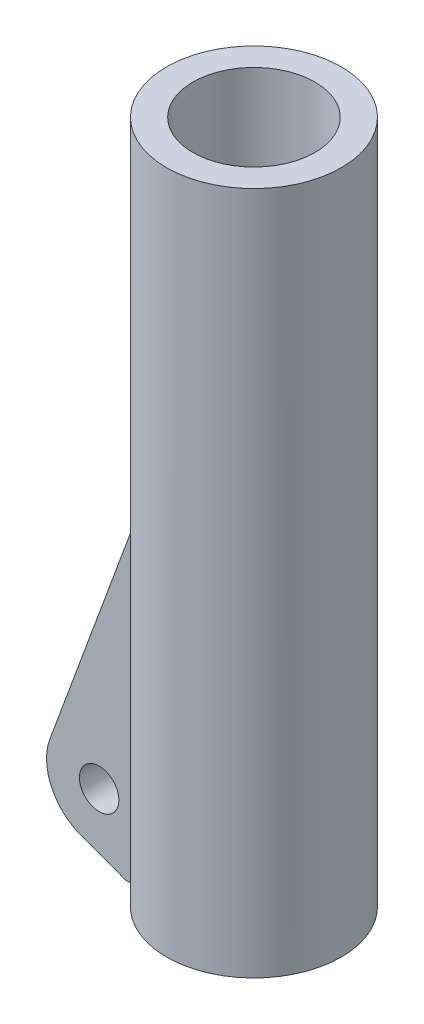
ISO-10303-21;
HEADER;
FILE_DESCRIPTION(('STEP AP214'),'2;1');
FILE_NAME('part.step','',(''),(''),'','','');
FILE_SCHEMA(('AUTOMOTIVE_DESIGN { 1 0 10303 214 1 1 1 1 }'));
ENDSEC;
DATA;
#1=APPLICATION_CONTEXT('core data for automotive mechanical design processes');
#2=APPLICATION_PROTOCOL_DEFINITION('international standard','automotive_design',2000,#1);
#3=PRODUCT_CONTEXT('',#1,'mechanical');
#4=PRODUCT('Part','Part','',(#3));
#5=PRODUCT_RELATED_PRODUCT_CATEGORY('part','',(#4));
#6=PRODUCT_DEFINITION_FORMATION('','',#4);
#7=PRODUCT_DEFINITION_CONTEXT('part definition',#1,'design');
#8=PRODUCT_DEFINITION('design','',#6,#7);
#9=PRODUCT_DEFINITION_SHAPE('','',#8);
#10=(LENGTH_UNIT() NAMED_UNIT(*) SI_UNIT(.MILLI.,.METRE.));
#11=(NAMED_UNIT(*) PLANE_ANGLE_UNIT() SI_UNIT($,.RADIAN.));
#12=(NAMED_UNIT(*) SI_UNIT($,.STERADIAN.) SOLID_ANGLE_UNIT());
#13=UNCERTAINTY_MEASURE_WITH_UNIT(LENGTH_MEASURE(1.E-05),#10,'distance_accuracy_value','');
#14=(GEOMETRIC_REPRESENTATION_CONTEXT(3) GLOBAL_UNCERTAINTY_ASSIGNED_CONTEXT((#13)) GLOBAL_UNIT_ASSIGNED_CONTEXT((#10,
#11,#12)) REPRESENTATION_CONTEXT('',''));
#15=CARTESIAN_POINT('',(0.,0.,0.));
#16=DIRECTION('',(0.,0.,1.));
#17=DIRECTION('',(1.,0.,0.));
#18=AXIS2_PLACEMENT_3D('',#15,#16,#17);
#19=CARTESIAN_POINT('',(0.,164.973,0.));
#20=DIRECTION('',(0.,1.,0.));
#21=DIRECTION('',(0.,0.,1.));
#22=AXIS2_PLACEMENT_3D('',#19,#20,#21);
#23=PLANE('',#22);
#24=CARTESIAN_POINT('',(0.,164.973,0.));
#25=DIRECTION('',(0.,1.,0.));
#26=DIRECTION('',(0.,0.,1.));
#27=AXIS2_PLACEMENT_3D('',#24,#25,#26);
#28=CIRCLE('',#27,42.164);
#29=CARTESIAN_POINT('',(0.,164.973,42.164));
#30=VERTEX_POINT('',#29);
#31=EDGE_CURVE('E125',#30,#30,#28,.T.);
#32=ORIENTED_EDGE('',*,*,#31,.T.);
#33=EDGE_LOOP('',(#32));
#34=FACE_BOUND('',#33,.T.);
#35=CARTESIAN_POINT('',(0.,164.973,0.));
#36=DIRECTION('',(0.,1.,0.));
#37=DIRECTION('',(0.,0.,1.));
#38=AXIS2_PLACEMENT_3D('',#35,#36,#37);
#39=CIRCLE('',#38,29.464);
#40=CARTESIAN_POINT('',(0.,164.973,-29.464));
#41=VERTEX_POINT('',#40);
#42=EDGE_CURVE('E119',#41,#41,#39,.T.);
#43=ORIENTED_EDGE('',*,*,#42,.F.);
#44=EDGE_LOOP('',(#43));
#45=FACE_BOUND('',#44,.T.);
#46=ADVANCED_FACE('F35',(#34,#45),#23,.T.);
#47=CARTESIAN_POINT('',(0.,-164.973,0.));
#48=DIRECTION('',(0.,1.,0.));
#49=DIRECTION('',(0.,0.,1.));
#50=AXIS2_PLACEMENT_3D('',#47,#48,#49);
#51=PLANE('',#50);
#52=CARTESIAN_POINT('',(0.,-164.973,0.));
#53=DIRECTION('',(0.,1.,0.));
#54=DIRECTION('',(0.,0.,1.));
#55=AXIS2_PLACEMENT_3D('',#52,#53,#54);
#56=CIRCLE('',#55,29.464);
#57=CARTESIAN_POINT('',(0.,-164.973,-29.464));
#58=VERTEX_POINT('',#57);
#59=EDGE_CURVE('E118',#58,#58,#56,.T.);
#60=ORIENTED_EDGE('',*,*,#59,.T.);
#61=EDGE_LOOP('',(#60));
#62=FACE_BOUND('',#61,.T.);
#63=CARTESIAN_POINT('',(0.,-164.973,0.));
#64=DIRECTION('',(0.,1.,0.));
#65=DIRECTION('',(0.,0.,1.));
#66=AXIS2_PLACEMENT_3D('',#63,#64,#65);
#67=CIRCLE('',#66,42.164);
#68=CARTESIAN_POINT('',(-37.2025332731186,-164.973,19.84375));
#69=VERTEX_POINT('',#68);
#70=CARTESIAN_POINT('',(-37.2025332731186,-164.973,-19.84375));
#71=VERTEX_POINT('',#70);
#72=EDGE_CURVE('E122',#69,#71,#67,.T.);
#73=ORIENTED_EDGE('',*,*,#72,.F.);
#74=DIRECTION('',(1.,0.,0.));
#75=VECTOR('',#74,1.);
#76=CARTESIAN_POINT('',(-42.164,-164.973,19.84375));
#77=LINE('',#76,#75);
#78=CARTESIAN_POINT('',(-42.164,-164.973,19.84375));
#79=VERTEX_POINT('',#78);
#80=EDGE_CURVE('E85',#79,#69,#77,.T.);
#81=ORIENTED_EDGE('',*,*,#80,.F.);
#82=DIRECTION('',(0.,0.,-1.));
#83=VECTOR('',#82,1.);
#84=CARTESIAN_POINT('',(-42.164,-164.973,19.84375));
#85=LINE('',#84,#83);
#86=CARTESIAN_POINT('',(-42.164,-164.973,-19.84375));
#87=VERTEX_POINT('',#86);
#88=EDGE_CURVE('E101',#79,#87,#85,.T.);
#89=ORIENTED_EDGE('',*,*,#88,.T.);
#90=DIRECTION('',(1.,0.,0.));
#91=VECTOR('',#90,1.);
#92=CARTESIAN_POINT('',(-42.164,-164.973,-19.84375));
#93=LINE('',#92,#91);
#94=EDGE_CURVE('E105',#87,#71,#93,.T.);
#95=ORIENTED_EDGE('',*,*,#94,.T.);
#96=EDGE_LOOP('',(#73,#81,#89,#95));
#97=FACE_BOUND('',#96,.T.);
#98=ADVANCED_FACE('F134',(#62,#97),#51,.F.);
#99=CARTESIAN_POINT('',(0.,164.973,0.));
#100=DIRECTION('',(0.,-1.,0.));
#101=DIRECTION('',(0.,0.,-1.));
#102=AXIS2_PLACEMENT_3D('',#99,#100,#101);
#103=CYLINDRICAL_SURFACE('',#102,42.164);
#104=CARTESIAN_POINT('',(0.,89.1108747435783,0.));
#105=DIRECTION('',(0.938313881066485,-0.345784702666196,0.));
#106=DIRECTION('',(-0.345784702666196,-0.938313881066485,0.));
#107=AXIS2_PLACEMENT_3D('',#104,#105,#106);
#108=ELLIPSE('',#107,121.937146654816,42.164);
#109=CARTESIAN_POINT('',(-37.2025332731186,-11.8411139125049,19.84375));
#110=VERTEX_POINT('',#109);
#111=CARTESIAN_POINT('',(-37.2025332731186,-11.8411139125049,-19.84375));
#112=VERTEX_POINT('',#111);
#113=EDGE_CURVE('E49',#110,#112,#108,.T.);
#114=ORIENTED_EDGE('',*,*,#113,.F.);
#115=DIRECTION('',(0.,-1.,0.));
#116=VECTOR('',#115,1.);
#117=CARTESIAN_POINT('',(-37.2025332731186,164.973,19.84375));
#118=LINE('',#117,#116);
#119=EDGE_CURVE('E11',#110,#69,#118,.T.);
#120=ORIENTED_EDGE('',*,*,#119,.T.);
#121=ORIENTED_EDGE('',*,*,#72,.T.);
#122=DIRECTION('',(0.,-1.,0.));
#123=VECTOR('',#122,1.);
#124=CARTESIAN_POINT('',(-37.2025332731186,164.973,-19.84375));
#125=LINE('',#124,#123);
#126=EDGE_CURVE('E43',#112,#71,#125,.T.);
#127=ORIENTED_EDGE('',*,*,#126,.F.);
#128=EDGE_LOOP('',(#114,#120,#121,#127));
#129=FACE_BOUND('',#128,.T.);
#130=ORIENTED_EDGE('',*,*,#31,.F.);
#131=EDGE_LOOP('',(#130));
#132=FACE_BOUND('',#131,.T.);
#133=ADVANCED_FACE('F37',(#129,#132),#103,.T.);
#134=CARTESIAN_POINT('',(0.,164.973,0.));
#135=DIRECTION('',(0.,-1.,0.));
#136=DIRECTION('',(0.,0.,-1.));
#137=AXIS2_PLACEMENT_3D('',#134,#135,#136);
#138=CYLINDRICAL_SURFACE('',#137,29.464);
#139=CARTESIAN_POINT('',(0.,-164.973,-29.464));
#140=CARTESIAN_POINT('',(0.,-161.5360625,-29.464));
#141=CARTESIAN_POINT('',(0.,-158.099125,-29.464));
#142=CARTESIAN_POINT('',(0.,-151.22525,-29.464));
#143=CARTESIAN_POINT('',(0.,-147.7883125,-29.464));
#144=CARTESIAN_POINT('',(0.,-140.9144375,-29.464));
#145=CARTESIAN_POINT('',(0.,-137.4775,-29.464));
#146=CARTESIAN_POINT('',(0.,-130.603625,-29.464));
#147=CARTESIAN_POINT('',(0.,-127.1666875,-29.464));
#148=CARTESIAN_POINT('',(0.,-120.2928125,-29.464));
#149=CARTESIAN_POINT('',(0.,-116.855875,-29.464));
#150=CARTESIAN_POINT('',(0.,-109.982,-29.464));
#151=CARTESIAN_POINT('',(0.,-106.5450625,-29.464));
#152=CARTESIAN_POINT('',(0.,-99.6711875,-29.464));
#153=CARTESIAN_POINT('',(0.,-96.23425,-29.464));
#154=CARTESIAN_POINT('',(0.,-89.360375,-29.464));
#155=CARTESIAN_POINT('',(0.,-85.9234375,-29.464));
#156=CARTESIAN_POINT('',(0.,-79.0495625,-29.464));
#157=CARTESIAN_POINT('',(0.,-75.612625,-29.464));
#158=CARTESIAN_POINT('',(0.,-68.73875,-29.464));
#159=CARTESIAN_POINT('',(0.,-65.3018125,-29.464));
#160=CARTESIAN_POINT('',(0.,-58.4279375,-29.464));
#161=CARTESIAN_POINT('',(0.,-54.991,-29.464));
#162=CARTESIAN_POINT('',(0.,-48.117125,-29.464));
#163=CARTESIAN_POINT('',(0.,-44.6801875,-29.464));
#164=CARTESIAN_POINT('',(0.,-37.8063125,-29.464));
#165=CARTESIAN_POINT('',(0.,-34.369375,-29.464));
#166=CARTESIAN_POINT('',(0.,-27.4955,-29.464));
#167=CARTESIAN_POINT('',(0.,-24.0585625,-29.464));
#168=CARTESIAN_POINT('',(0.,-17.1846875,-29.464));
#169=CARTESIAN_POINT('',(0.,-13.74775,-29.464));
#170=CARTESIAN_POINT('',(0.,-6.87387499999999,-29.464));
#171=CARTESIAN_POINT('',(0.,-3.43693749999999,-29.464));
#172=CARTESIAN_POINT('',(0.,3.43693749999999,-29.464));
#173=CARTESIAN_POINT('',(0.,6.87387499999999,-29.464));
#174=CARTESIAN_POINT('',(0.,13.74775,-29.464));
#175=CARTESIAN_POINT('',(0.,17.1846875,-29.464));
#176=CARTESIAN_POINT('',(0.,24.0585625,-29.464));
#177=CARTESIAN_POINT('',(0.,27.4955,-29.464));
#178=CARTESIAN_POINT('',(0.,34.369375,-29.464));
#179=CARTESIAN_POINT('',(0.,37.8063125,-29.464));
#180=CARTESIAN_POINT('',(0.,44.6801875,-29.464));
#181=CARTESIAN_POINT('',(0.,48.117125,-29.464));
#182=CARTESIAN_POINT('',(0.,54.991,-29.464));
#183=CARTESIAN_POINT('',(0.,58.4279375,-29.464));
#184=CARTESIAN_POINT('',(0.,65.3018125,-29.464));
#185=CARTESIAN_POINT('',(0.,68.73875,-29.464));
#186=CARTESIAN_POINT('',(0.,75.612625,-29.464));
#187=CARTESIAN_POINT('',(0.,79.0495625,-29.464));
#188=CARTESIAN_POINT('',(0.,85.9234375,-29.464));
#189=CARTESIAN_POINT('',(0.,89.360375,-29.464));
#190=CARTESIAN_POINT('',(0.,96.23425,-29.464));
#191=CARTESIAN_POINT('',(0.,99.6711875,-29.464));
#192=CARTESIAN_POINT('',(0.,106.5450625,-29.464));
#193=CARTESIAN_POINT('',(0.,109.982,-29.464));
#194=CARTESIAN_POINT('',(0.,116.855875,-29.464));
#195=CARTESIAN_POINT('',(0.,120.2928125,-29.464));
#196=CARTESIAN_POINT('',(0.,127.1666875,-29.464));
#197=CARTESIAN_POINT('',(0.,130.603625,-29.464));
#198=CARTESIAN_POINT('',(0.,137.4775,-29.464));
#199=CARTESIAN_POINT('',(0.,140.9144375,-29.464));
#200=CARTESIAN_POINT('',(0.,147.7883125,-29.464));
#201=CARTESIAN_POINT('',(0.,151.22525,-29.464));
#202=CARTESIAN_POINT('',(0.,158.099125,-29.464));
#203=CARTESIAN_POINT('',(0.,161.5360625,-29.464));
#204=CARTESIAN_POINT('',(0.,164.973,-29.464));
#205=B_SPLINE_CURVE_WITH_KNOTS('',3,(#139,#140,#141,#142,#143,#144,#145,#146,#147,#148,#149,
#150,#151,#152,#153,#154,#155,#156,#157,#158,#159,#160,#161,#162,#163,#164,#165,#166,#167,#168,
#169,#170,#171,#172,#173,#174,#175,#176,#177,#178,#179,#180,#181,#182,#183,#184,#185,#186,#187,
#188,#189,#190,#191,#192,#193,#194,#195,#196,#197,#198,#199,#200,#201,#202,#203,#204),
.UNSPECIFIED.,.F.,.F.,(4,2,2,2,2,2,2,2,2,2,2,2,2,2,2,2,2,2,2,2,2,2,2,2,2,2,2,2,2,2,2,2,4),(0.,
10.3108125,20.621625,30.9324375,41.24325,51.5540625,61.864875,72.1756875,82.4865,92.7973125,
103.108125,113.4189375,123.72975,134.0405625,144.351375,154.6621875,164.973,175.2838125,
185.594625,195.9054375,206.21625,216.5270625,226.837875,237.1486875,247.4595,257.7703125,
268.081125,278.3919375,288.70275,299.0135625,309.324375,319.6351875,329.946),.UNSPECIFIED.);
#206=EDGE_CURVE('BSEAM150',#58,#41,#205,.T.);
#207=ORIENTED_EDGE('',*,*,#59,.F.);
#208=ORIENTED_EDGE('',*,*,#42,.T.);
#209=ORIENTED_EDGE('',*,*,#206,.T.);
#210=ORIENTED_EDGE('',*,*,#206,.F.);
#211=EDGE_LOOP('',(#207,#209,#208,#210));
#212=FACE_BOUND('',#211,.T.);
#213=ADVANCED_FACE('F150',(#212),#138,.F.);
#214=CARTESIAN_POINT('',(-54.864,-133.223,19.84375));
#215=DIRECTION('',(0.,0.,1.));
#216=DIRECTION('',(1.,0.,0.));
#217=AXIS2_PLACEMENT_3D('',#214,#215,#216);
#218=PLANE('',#217);
#219=CARTESIAN_POINT('',(-54.864,-133.223,19.84375));
#220=DIRECTION('',(0.,0.,1.));
#221=DIRECTION('',(1.,0.,0.));
#222=AXIS2_PLACEMENT_3D('',#219,#220,#221);
#223=CIRCLE('',#222,9.525);
#224=CARTESIAN_POINT('',(-64.389,-133.223,19.84375));
#225=VERTEX_POINT('',#224);
#226=EDGE_CURVE('E108',#225,#225,#223,.T.);
#227=ORIENTED_EDGE('',*,*,#226,.F.);
#228=EDGE_LOOP('',(#227));
#229=FACE_BOUND('',#228,.T.);
#230=ORIENTED_EDGE('',*,*,#119,.F.);
#231=DIRECTION('',(-0.345784702666197,-0.938313881066485,0.));
#232=VECTOR('',#231,1.);
#233=CARTESIAN_POINT('',(-78.6971725790887,-124.440068552279,19.84375));
#234=LINE('',#233,#232);
#235=CARTESIAN_POINT('',(-78.6971725790887,-124.440068552279,19.84375));
#236=VERTEX_POINT('',#235);
#237=EDGE_CURVE('E77',#110,#236,#234,.T.);
#238=ORIENTED_EDGE('',*,*,#237,.T.);
#239=CARTESIAN_POINT('',(-54.864,-133.223,19.84375));
#240=DIRECTION('',(0.,0.,1.));
#241=DIRECTION('',(1.,0.,0.));
#242=AXIS2_PLACEMENT_3D('',#239,#240,#241);
#243=CIRCLE('',#242,25.4);
#244=CARTESIAN_POINT('',(-63.6469314477214,-157.056172579089,19.84375));
#245=VERTEX_POINT('',#244);
#246=EDGE_CURVE('E81',#236,#245,#243,.T.);
#247=ORIENTED_EDGE('',*,*,#246,.T.);
#248=DIRECTION('',(0.938313881066485,-0.345784702666196,0.));
#249=VECTOR('',#248,1.);
#250=CARTESIAN_POINT('',(-63.6469314477214,-157.056172579089,19.84375));
#251=LINE('',#250,#249);
#252=EDGE_CURVE('E99',#245,#79,#251,.T.);
#253=ORIENTED_EDGE('',*,*,#252,.T.);
#254=ORIENTED_EDGE('',*,*,#80,.T.);
#255=EDGE_LOOP('',(#230,#238,#247,#253,#254));
#256=FACE_BOUND('',#255,.T.);
#257=ADVANCED_FACE('F79',(#229,#256),#218,.T.);
#258=CARTESIAN_POINT('',(-54.864,-133.223,-19.84375));
#259=DIRECTION('',(0.,0.,1.));
#260=DIRECTION('',(1.,0.,0.));
#261=AXIS2_PLACEMENT_3D('',#258,#259,#260);
#262=PLANE('',#261);
#263=CARTESIAN_POINT('',(-54.864,-133.223,-19.84375));
#264=DIRECTION('',(0.,0.,1.));
#265=DIRECTION('',(1.,0.,0.));
#266=AXIS2_PLACEMENT_3D('',#263,#264,#265);
#267=CIRCLE('',#266,9.525);
#268=CARTESIAN_POINT('',(-64.389,-133.223,-19.84375));
#269=VERTEX_POINT('',#268);
#270=EDGE_CURVE('E140',#269,#269,#267,.T.);
#271=ORIENTED_EDGE('',*,*,#270,.T.);
#272=EDGE_LOOP('',(#271));
#273=FACE_BOUND('',#272,.T.);
#274=DIRECTION('',(-0.345784702666197,-0.938313881066485,0.));
#275=VECTOR('',#274,1.);
#276=CARTESIAN_POINT('',(-78.6971725790887,-124.440068552279,-19.84375));
#277=LINE('',#276,#275);
#278=CARTESIAN_POINT('',(-78.6971725790887,-124.440068552279,-19.84375));
#279=VERTEX_POINT('',#278);
#280=EDGE_CURVE('E91',#112,#279,#277,.T.);
#281=ORIENTED_EDGE('',*,*,#280,.F.);
#282=ORIENTED_EDGE('',*,*,#126,.T.);
#283=ORIENTED_EDGE('',*,*,#94,.F.);
#284=DIRECTION('',(0.938313881066485,-0.345784702666196,0.));
#285=VECTOR('',#284,1.);
#286=CARTESIAN_POINT('',(-63.6469314477214,-157.056172579089,-19.84375));
#287=LINE('',#286,#285);
#288=CARTESIAN_POINT('',(-63.6469314477214,-157.056172579089,-19.84375));
#289=VERTEX_POINT('',#288);
#290=EDGE_CURVE('E112',#289,#87,#287,.T.);
#291=ORIENTED_EDGE('',*,*,#290,.F.);
#292=CARTESIAN_POINT('',(-54.864,-133.223,-19.84375));
#293=DIRECTION('',(0.,0.,1.));
#294=DIRECTION('',(1.,0.,0.));
#295=AXIS2_PLACEMENT_3D('',#292,#293,#294);
#296=CIRCLE('',#295,25.4);
#297=EDGE_CURVE('E110',#279,#289,#296,.T.);
#298=ORIENTED_EDGE('',*,*,#297,.F.);
#299=EDGE_LOOP('',(#281,#282,#283,#291,#298));
#300=FACE_BOUND('',#299,.T.);
#301=ADVANCED_FACE('F131',(#273,#300),#262,.F.);
#302=CARTESIAN_POINT('',(-78.6971725790887,-124.440068552279,19.84375));
#303=DIRECTION('',(0.938313881066485,-0.345784702666196,0.));
#304=DIRECTION('',(0.345784702666196,0.938313881066485,0.));
#305=AXIS2_PLACEMENT_3D('',#302,#303,#304);
#306=PLANE('',#305);
#307=ORIENTED_EDGE('',*,*,#237,.F.);
#308=ORIENTED_EDGE('',*,*,#113,.T.);
#309=ORIENTED_EDGE('',*,*,#280,.T.);
#310=DIRECTION('',(0.,0.,-1.));
#311=VECTOR('',#310,1.);
#312=CARTESIAN_POINT('',(-78.6971725790887,-124.440068552279,19.84375));
#313=LINE('',#312,#311);
#314=EDGE_CURVE('E88',#236,#279,#313,.T.);
#315=ORIENTED_EDGE('',*,*,#314,.F.);
#316=EDGE_LOOP('',(#307,#308,#309,#315));
#317=FACE_BOUND('',#316,.T.);
#318=ADVANCED_FACE('F89',(#317),#306,.F.);
#319=CARTESIAN_POINT('',(-54.864,-133.223,19.84375));
#320=DIRECTION('',(0.,0.,-1.));
#321=DIRECTION('',(-1.,0.,0.));
#322=AXIS2_PLACEMENT_3D('',#319,#320,#321);
#323=CYLINDRICAL_SURFACE('',#322,25.4);
#324=ORIENTED_EDGE('',*,*,#297,.T.);
#325=DIRECTION('',(0.,0.,-1.));
#326=VECTOR('',#325,1.);
#327=CARTESIAN_POINT('',(-63.6469314477214,-157.056172579089,19.84375));
#328=LINE('',#327,#326);
#329=EDGE_CURVE('E94',#245,#289,#328,.T.);
#330=ORIENTED_EDGE('',*,*,#329,.F.);
#331=ORIENTED_EDGE('',*,*,#246,.F.);
#332=ORIENTED_EDGE('',*,*,#314,.T.);
#333=EDGE_LOOP('',(#324,#330,#331,#332));
#334=FACE_BOUND('',#333,.T.);
#335=ADVANCED_FACE('F96',(#334),#323,.T.);
#336=CARTESIAN_POINT('',(-63.6469314477214,-157.056172579089,19.84375));
#337=DIRECTION('',(0.345784702666196,0.938313881066485,0.));
#338=DIRECTION('',(-0.938313881066486,0.345784702666196,0.));
#339=AXIS2_PLACEMENT_3D('',#336,#337,#338);
#340=PLANE('',#339);
#341=ORIENTED_EDGE('',*,*,#290,.T.);
#342=ORIENTED_EDGE('',*,*,#88,.F.);
#343=ORIENTED_EDGE('',*,*,#252,.F.);
#344=ORIENTED_EDGE('',*,*,#329,.T.);
#345=EDGE_LOOP('',(#341,#342,#343,#344));
#346=FACE_BOUND('',#345,.T.);
#347=ADVANCED_FACE('F138',(#346),#340,.F.);
#348=CARTESIAN_POINT('',(-54.864,-133.223,19.84375));
#349=DIRECTION('',(0.,0.,-1.));
#350=DIRECTION('',(-1.,0.,0.));
#351=AXIS2_PLACEMENT_3D('',#348,#349,#350);
#352=CYLINDRICAL_SURFACE('',#351,9.525);
#353=CARTESIAN_POINT('',(-64.389,-133.223,19.84375));
#354=CARTESIAN_POINT('',(-64.389,-133.223,19.4303385416667));
#355=CARTESIAN_POINT('',(-64.389,-133.223,19.0169270833333));
#356=CARTESIAN_POINT('',(-64.389,-133.223,18.1901041666667));
#357=CARTESIAN_POINT('',(-64.389,-133.223,17.7766927083333));
#358=CARTESIAN_POINT('',(-64.389,-133.223,16.9498697916667));
#359=CARTESIAN_POINT('',(-64.389,-133.223,16.5364583333333));
#360=CARTESIAN_POINT('',(-64.389,-133.223,15.7096354166667));
#361=CARTESIAN_POINT('',(-64.389,-133.223,15.2962239583333));
#362=CARTESIAN_POINT('',(-64.389,-133.223,14.4694010416667));
#363=CARTESIAN_POINT('',(-64.389,-133.223,14.0559895833333));
#364=CARTESIAN_POINT('',(-64.389,-133.223,13.2291666666667));
#365=CARTESIAN_POINT('',(-64.389,-133.223,12.8157552083333));
#366=CARTESIAN_POINT('',(-64.389,-133.223,11.9889322916667));
#367=CARTESIAN_POINT('',(-64.389,-133.223,11.5755208333333));
#368=CARTESIAN_POINT('',(-64.389,-133.223,10.7486979166667));
#369=CARTESIAN_POINT('',(-64.389,-133.223,10.3352864583333));
#370=CARTESIAN_POINT('',(-64.389,-133.223,9.50846354166666));
#371=CARTESIAN_POINT('',(-64.389,-133.223,9.09505208333333));
#372=CARTESIAN_POINT('',(-64.389,-133.223,8.26822916666666));
#373=CARTESIAN_POINT('',(-64.389,-133.223,7.85481770833333));
#374=CARTESIAN_POINT('',(-64.389,-133.223,7.02799479166666));
#375=CARTESIAN_POINT('',(-64.389,-133.223,6.61458333333333));
#376=CARTESIAN_POINT('',(-64.389,-133.223,5.78776041666666));
#377=CARTESIAN_POINT('',(-64.389,-133.223,5.37434895833333));
#378=CARTESIAN_POINT('',(-64.389,-133.223,4.54752604166666));
#379=CARTESIAN_POINT('',(-64.389,-133.223,4.13411458333333));
#380=CARTESIAN_POINT('',(-64.389,-133.223,3.30729166666666));
#381=CARTESIAN_POINT('',(-64.389,-133.223,2.89388020833333));
#382=CARTESIAN_POINT('',(-64.389,-133.223,2.06705729166666));
#383=CARTESIAN_POINT('',(-64.389,-133.223,1.65364583333333));
#384=CARTESIAN_POINT('',(-64.389,-133.223,0.826822916666663));
#385=CARTESIAN_POINT('',(-64.389,-133.223,0.41341145833333));
#386=CARTESIAN_POINT('',(-64.389,-133.223,-0.413411458333337));
#387=CARTESIAN_POINT('',(-64.389,-133.223,-0.82682291666667));
#388=CARTESIAN_POINT('',(-64.389,-133.223,-1.65364583333334));
#389=CARTESIAN_POINT('',(-64.389,-133.223,-2.06705729166667));
#390=CARTESIAN_POINT('',(-64.389,-133.223,-2.89388020833334));
#391=CARTESIAN_POINT('',(-64.389,-133.223,-3.30729166666667));
#392=CARTESIAN_POINT('',(-64.389,-133.223,-4.13411458333334));
#393=CARTESIAN_POINT('',(-64.389,-133.223,-4.54752604166667));
#394=CARTESIAN_POINT('',(-64.389,-133.223,-5.37434895833334));
#395=CARTESIAN_POINT('',(-64.389,-133.223,-5.78776041666667));
#396=CARTESIAN_POINT('',(-64.389,-133.223,-6.61458333333334));
#397=CARTESIAN_POINT('',(-64.389,-133.223,-7.02799479166667));
#398=CARTESIAN_POINT('',(-64.389,-133.223,-7.85481770833334));
#399=CARTESIAN_POINT('',(-64.389,-133.223,-8.26822916666667));
#400=CARTESIAN_POINT('',(-64.389,-133.223,-9.09505208333334));
#401=CARTESIAN_POINT('',(-64.389,-133.223,-9.50846354166667));
#402=CARTESIAN_POINT('',(-64.389,-133.223,-10.3352864583333));
#403=CARTESIAN_POINT('',(-64.389,-133.223,-10.7486979166667));
#404=CARTESIAN_POINT('',(-64.389,-133.223,-11.5755208333333));
#405=CARTESIAN_POINT('',(-64.389,-133.223,-11.9889322916667));
#406=CARTESIAN_POINT('',(-64.389,-133.223,-12.8157552083333));
#407=CARTESIAN_POINT('',(-64.389,-133.223,-13.2291666666667));
#408=CARTESIAN_POINT('',(-64.389,-133.223,-14.0559895833333));
#409=CARTESIAN_POINT('',(-64.389,-133.223,-14.4694010416667));
#410=CARTESIAN_POINT('',(-64.389,-133.223,-15.2962239583333));
#411=CARTESIAN_POINT('',(-64.389,-133.223,-15.7096354166667));
#412=CARTESIAN_POINT('',(-64.389,-133.223,-16.5364583333333));
#413=CARTESIAN_POINT('',(-64.389,-133.223,-16.9498697916667));
#414=CARTESIAN_POINT('',(-64.389,-133.223,-17.7766927083333));
#415=CARTESIAN_POINT('',(-64.389,-133.223,-18.1901041666667));
#416=CARTESIAN_POINT('',(-64.389,-133.223,-19.0169270833333));
#417=CARTESIAN_POINT('',(-64.389,-133.223,-19.4303385416667));
#418=CARTESIAN_POINT('',(-64.389,-133.223,-19.84375));
#419=B_SPLINE_CURVE_WITH_KNOTS('',3,(#353,#354,#355,#356,#357,#358,#359,#360,#361,#362,#363,
#364,#365,#366,#367,#368,#369,#370,#371,#372,#373,#374,#375,#376,#377,#378,#379,#380,#381,#382,
#383,#384,#385,#386,#387,#388,#389,#390,#391,#392,#393,#394,#395,#396,#397,#398,#399,#400,#401,
#402,#403,#404,#405,#406,#407,#408,#409,#410,#411,#412,#413,#414,#415,#416,#417,#418),
.UNSPECIFIED.,.F.,.F.,(4,2,2,2,2,2,2,2,2,2,2,2,2,2,2,2,2,2,2,2,2,2,2,2,2,2,2,2,2,2,2,2,4),(0.,
1.240234375,2.48046875,3.720703125,4.9609375,6.201171875,7.44140625,8.681640625,9.921875,
11.162109375,12.40234375,13.642578125,14.8828125,16.123046875,17.36328125,18.603515625,19.84375,
21.083984375,22.32421875,23.564453125,24.8046875,26.044921875,27.28515625,28.525390625,
29.765625,31.005859375,32.24609375,33.486328125,34.7265625,35.966796875,37.20703125,
38.447265625,39.6875),.UNSPECIFIED.);
#420=EDGE_CURVE('BSEAM146',#225,#269,#419,.T.);
#421=ORIENTED_EDGE('',*,*,#226,.T.);
#422=ORIENTED_EDGE('',*,*,#270,.F.);
#423=ORIENTED_EDGE('',*,*,#420,.T.);
#424=ORIENTED_EDGE('',*,*,#420,.F.);
#425=EDGE_LOOP('',(#421,#423,#422,#424));
#426=FACE_BOUND('',#425,.T.);
#427=ADVANCED_FACE('F146',(#426),#352,.F.);
#428=CLOSED_SHELL('',(#46,#98,#133,#213,#257,#301,#318,#335,#347,#427));
#429=MANIFOLD_SOLID_BREP('B2',#428);
#430=ADVANCED_BREP_SHAPE_REPRESENTATION('',(#18,#429),#14);
#431=SHAPE_DEFINITION_REPRESENTATION(#9,#430);
ENDSEC;
END-ISO-10303-21;
